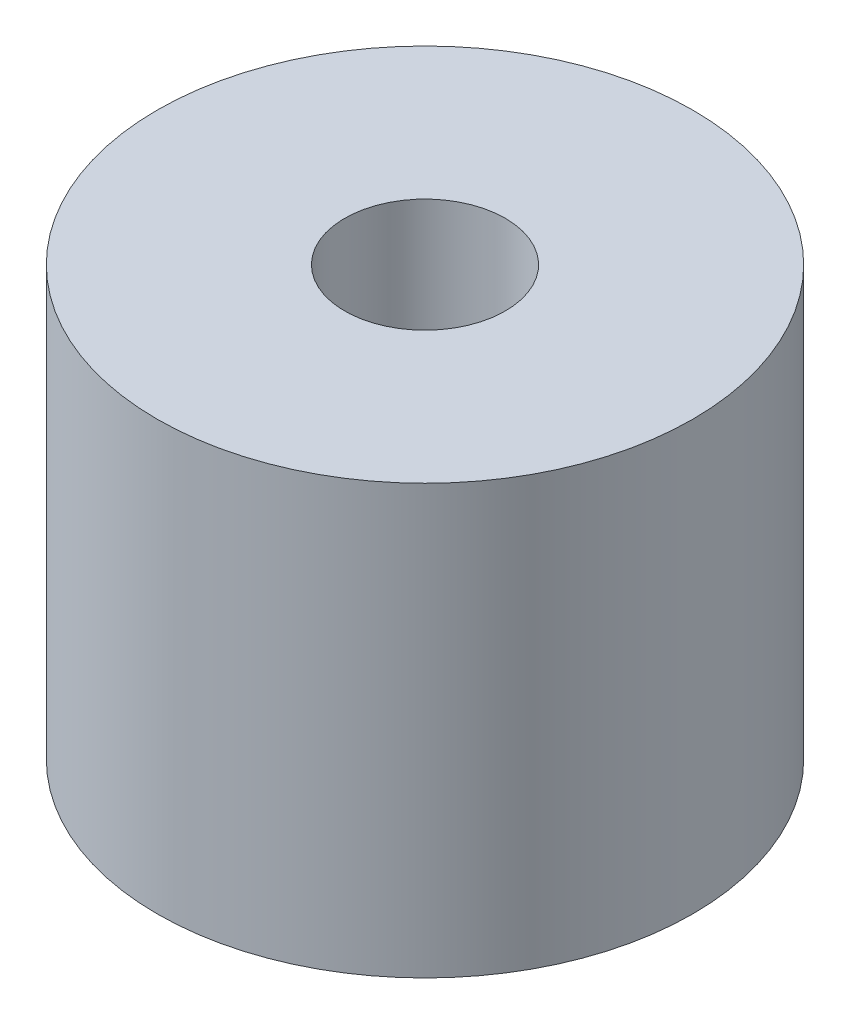
ISO-10303-21;
HEADER;
FILE_DESCRIPTION(('STEP AP214'),'2;1');
FILE_NAME('part.step','',(''),(''),'','','');
FILE_SCHEMA(('AUTOMOTIVE_DESIGN { 1 0 10303 214 1 1 1 1 }'));
ENDSEC;
DATA;
#1=APPLICATION_CONTEXT('core data for automotive mechanical design processes');
#2=APPLICATION_PROTOCOL_DEFINITION('international standard','automotive_design',2000,#1);
#3=PRODUCT_CONTEXT('',#1,'mechanical');
#4=PRODUCT('Part','Part','',(#3));
#5=PRODUCT_RELATED_PRODUCT_CATEGORY('part','',(#4));
#6=PRODUCT_DEFINITION_FORMATION('','',#4);
#7=PRODUCT_DEFINITION_CONTEXT('part definition',#1,'design');
#8=PRODUCT_DEFINITION('design','',#6,#7);
#9=PRODUCT_DEFINITION_SHAPE('','',#8);
#10=(LENGTH_UNIT() NAMED_UNIT(*) SI_UNIT(.MILLI.,.METRE.));
#11=(NAMED_UNIT(*) PLANE_ANGLE_UNIT() SI_UNIT($,.RADIAN.));
#12=(NAMED_UNIT(*) SI_UNIT($,.STERADIAN.) SOLID_ANGLE_UNIT());
#13=UNCERTAINTY_MEASURE_WITH_UNIT(LENGTH_MEASURE(1.E-05),#10,'distance_accuracy_value','');
#14=(GEOMETRIC_REPRESENTATION_CONTEXT(3) GLOBAL_UNCERTAINTY_ASSIGNED_CONTEXT((#13)) GLOBAL_UNIT_ASSIGNED_CONTEXT((#10,
#11,#12)) REPRESENTATION_CONTEXT('',''));
#15=CARTESIAN_POINT('',(0.,0.,0.));
#16=DIRECTION('',(0.,0.,1.));
#17=DIRECTION('',(1.,0.,0.));
#18=AXIS2_PLACEMENT_3D('',#15,#16,#17);
#19=CARTESIAN_POINT('',(0.,-40.,0.));
#20=DIRECTION('',(0.,1.,0.));
#21=DIRECTION('',(0.,0.,1.));
#22=AXIS2_PLACEMENT_3D('',#19,#20,#21);
#23=CYLINDRICAL_SURFACE('',#22,25.);
#24=CARTESIAN_POINT('',(0.,-40.,0.));
#25=DIRECTION('',(0.,1.,0.));
#26=DIRECTION('',(0.,0.,1.));
#27=AXIS2_PLACEMENT_3D('',#24,#25,#26);
#28=CIRCLE('',#27,25.);
#29=CARTESIAN_POINT('',(0.,-40.,25.));
#30=VERTEX_POINT('',#29);
#31=EDGE_CURVE('E10',#30,#30,#28,.T.);
#32=ORIENTED_EDGE('',*,*,#31,.T.);
#33=EDGE_LOOP('',(#32));
#34=FACE_BOUND('',#33,.T.);
#35=CARTESIAN_POINT('',(0.,0.,0.));
#36=DIRECTION('',(0.,1.,0.));
#37=DIRECTION('',(0.,0.,1.));
#38=AXIS2_PLACEMENT_3D('',#35,#36,#37);
#39=CIRCLE('',#38,25.);
#40=CARTESIAN_POINT('',(0.,0.,25.));
#41=VERTEX_POINT('',#40);
#42=EDGE_CURVE('E37',#41,#41,#39,.T.);
#43=ORIENTED_EDGE('',*,*,#42,.F.);
#44=EDGE_LOOP('',(#43));
#45=FACE_BOUND('',#44,.T.);
#46=ADVANCED_FACE('F34',(#34,#45),#23,.T.);
#47=CARTESIAN_POINT('',(0.,-40.,0.));
#48=DIRECTION('',(0.,1.,0.));
#49=DIRECTION('',(0.,0.,1.));
#50=AXIS2_PLACEMENT_3D('',#47,#48,#49);
#51=PLANE('',#50);
#52=CARTESIAN_POINT('',(0.,-40.,0.));
#53=DIRECTION('',(0.,-1.,0.));
#54=DIRECTION('',(0.,0.,-1.));
#55=AXIS2_PLACEMENT_3D('',#52,#53,#54);
#56=CIRCLE('',#55,11.);
#57=CARTESIAN_POINT('',(0.,-40.,-11.));
#58=VERTEX_POINT('',#57);
#59=EDGE_CURVE('E46',#58,#58,#56,.T.);
#60=ORIENTED_EDGE('',*,*,#59,.F.);
#61=EDGE_LOOP('',(#60));
#62=FACE_BOUND('',#61,.T.);
#63=ORIENTED_EDGE('',*,*,#31,.F.);
#64=EDGE_LOOP('',(#63));
#65=FACE_BOUND('',#64,.T.);
#66=ADVANCED_FACE('F79',(#62,#65),#51,.F.);
#67=CARTESIAN_POINT('',(0.,0.,0.));
#68=DIRECTION('',(0.,1.,0.));
#69=DIRECTION('',(0.,0.,1.));
#70=AXIS2_PLACEMENT_3D('',#67,#68,#69);
#71=PLANE('',#70);
#72=CARTESIAN_POINT('',(0.,0.,0.));
#73=DIRECTION('',(0.,-1.,0.));
#74=DIRECTION('',(0.,0.,-1.));
#75=AXIS2_PLACEMENT_3D('',#72,#73,#74);
#76=CIRCLE('',#75,7.5);
#77=CARTESIAN_POINT('',(0.,0.,-7.5));
#78=VERTEX_POINT('',#77);
#79=EDGE_CURVE('E49',#78,#78,#76,.T.);
#80=ORIENTED_EDGE('',*,*,#79,.T.);
#81=EDGE_LOOP('',(#80));
#82=FACE_BOUND('',#81,.T.);
#83=ORIENTED_EDGE('',*,*,#42,.T.);
#84=EDGE_LOOP('',(#83));
#85=FACE_BOUND('',#84,.T.);
#86=ADVANCED_FACE('F58',(#82,#85),#71,.T.);
#87=CARTESIAN_POINT('',(0.,-35.,0.));
#88=DIRECTION('',(0.,-1.,0.));
#89=DIRECTION('',(0.,0.,-1.));
#90=AXIS2_PLACEMENT_3D('',#87,#88,#89);
#91=CYLINDRICAL_SURFACE('',#90,11.);
#92=CARTESIAN_POINT('',(0.,-35.,0.));
#93=DIRECTION('',(0.,-1.,0.));
#94=DIRECTION('',(0.,0.,-1.));
#95=AXIS2_PLACEMENT_3D('',#92,#93,#94);
#96=CIRCLE('',#95,11.);
#97=CARTESIAN_POINT('',(0.,-35.,-11.));
#98=VERTEX_POINT('',#97);
#99=EDGE_CURVE('E44',#98,#98,#96,.T.);
#100=ORIENTED_EDGE('',*,*,#99,.F.);
#101=EDGE_LOOP('',(#100));
#102=FACE_BOUND('',#101,.T.);
#103=ORIENTED_EDGE('',*,*,#59,.T.);
#104=EDGE_LOOP('',(#103));
#105=FACE_BOUND('',#104,.T.);
#106=ADVANCED_FACE('F70',(#102,#105),#91,.F.);
#107=CARTESIAN_POINT('',(0.,-35.,0.));
#108=DIRECTION('',(0.,-1.,0.));
#109=DIRECTION('',(0.,0.,-1.));
#110=AXIS2_PLACEMENT_3D('',#107,#108,#109);
#111=PLANE('',#110);
#112=CARTESIAN_POINT('',(0.,-35.,0.));
#113=DIRECTION('',(0.,-1.,0.));
#114=DIRECTION('',(0.,0.,-1.));
#115=AXIS2_PLACEMENT_3D('',#112,#113,#114);
#116=CIRCLE('',#115,7.5);
#117=CARTESIAN_POINT('',(0.,-35.,-7.5));
#118=VERTEX_POINT('',#117);
#119=EDGE_CURVE('E52',#118,#118,#116,.T.);
#120=ORIENTED_EDGE('',*,*,#119,.F.);
#121=EDGE_LOOP('',(#120));
#122=FACE_BOUND('',#121,.T.);
#123=ORIENTED_EDGE('',*,*,#99,.T.);
#124=EDGE_LOOP('',(#123));
#125=FACE_BOUND('',#124,.T.);
#126=ADVANCED_FACE('F64',(#122,#125),#111,.T.);
#127=CARTESIAN_POINT('',(0.,0.,0.));
#128=DIRECTION('',(0.,-1.,0.));
#129=DIRECTION('',(0.,0.,-1.));
#130=AXIS2_PLACEMENT_3D('',#127,#128,#129);
#131=CYLINDRICAL_SURFACE('',#130,7.5);
#132=ORIENTED_EDGE('',*,*,#79,.F.);
#133=EDGE_LOOP('',(#132));
#134=FACE_BOUND('',#133,.T.);
#135=ORIENTED_EDGE('',*,*,#119,.T.);
#136=EDGE_LOOP('',(#135));
#137=FACE_BOUND('',#136,.T.);
#138=ADVANCED_FACE('F61',(#134,#137),#131,.F.);
#139=CLOSED_SHELL('',(#46,#66,#86,#106,#126,#138));
#140=MANIFOLD_SOLID_BREP('B2',#139);
#141=ADVANCED_BREP_SHAPE_REPRESENTATION('',(#18,#140),#14);
#142=SHAPE_DEFINITION_REPRESENTATION(#9,#141);
ENDSEC;
END-ISO-10303-21;
